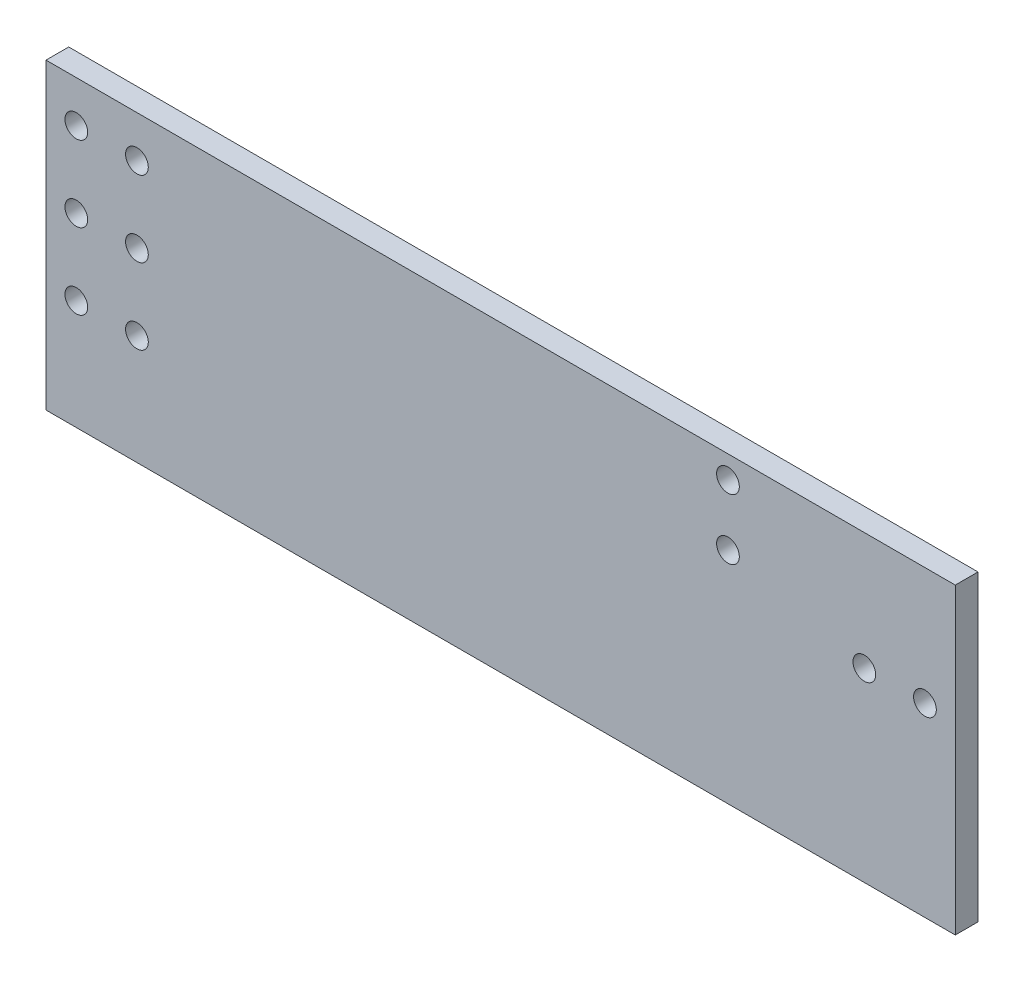
ISO-10303-21;
HEADER;
FILE_DESCRIPTION(('STEP AP214'),'2;1');
FILE_NAME('part.step','',(''),(''),'','','');
FILE_SCHEMA(('AUTOMOTIVE_DESIGN { 1 0 10303 214 1 1 1 1 }'));
ENDSEC;
DATA;
#1=APPLICATION_CONTEXT('core data for automotive mechanical design processes');
#2=APPLICATION_PROTOCOL_DEFINITION('international standard','automotive_design',2000,#1);
#3=PRODUCT_CONTEXT('',#1,'mechanical');
#4=PRODUCT('Part','Part','',(#3));
#5=PRODUCT_RELATED_PRODUCT_CATEGORY('part','',(#4));
#6=PRODUCT_DEFINITION_FORMATION('','',#4);
#7=PRODUCT_DEFINITION_CONTEXT('part definition',#1,'design');
#8=PRODUCT_DEFINITION('design','',#6,#7);
#9=PRODUCT_DEFINITION_SHAPE('','',#8);
#10=(LENGTH_UNIT() NAMED_UNIT(*) SI_UNIT(.MILLI.,.METRE.));
#11=(NAMED_UNIT(*) PLANE_ANGLE_UNIT() SI_UNIT($,.RADIAN.));
#12=(NAMED_UNIT(*) SI_UNIT($,.STERADIAN.) SOLID_ANGLE_UNIT());
#13=UNCERTAINTY_MEASURE_WITH_UNIT(LENGTH_MEASURE(1.E-05),#10,'distance_accuracy_value','');
#14=(GEOMETRIC_REPRESENTATION_CONTEXT(3) GLOBAL_UNCERTAINTY_ASSIGNED_CONTEXT((#13)) GLOBAL_UNIT_ASSIGNED_CONTEXT((#10,
#11,#12)) REPRESENTATION_CONTEXT('',''));
#15=CARTESIAN_POINT('',(0.,0.,0.));
#16=DIRECTION('',(0.,0.,1.));
#17=DIRECTION('',(1.,0.,0.));
#18=AXIS2_PLACEMENT_3D('',#15,#16,#17);
#19=CARTESIAN_POINT('',(0.,0.,3.));
#20=DIRECTION('',(0.,0.,-1.));
#21=DIRECTION('',(-1.,0.,0.));
#22=AXIS2_PLACEMENT_3D('',#19,#20,#21);
#23=PLANE('',#22);
#24=CARTESIAN_POINT('',(-56.0000000000058,0.,3.));
#25=DIRECTION('',(0.,0.,1.));
#26=DIRECTION('',(1.,0.,0.));
#27=AXIS2_PLACEMENT_3D('',#24,#25,#26);
#28=CIRCLE('',#27,1.5);
#29=CARTESIAN_POINT('',(-54.5000000000058,0.,3.));
#30=VERTEX_POINT('',#29);
#31=EDGE_CURVE('E140',#30,#30,#28,.T.);
#32=ORIENTED_EDGE('',*,*,#31,.F.);
#33=EDGE_LOOP('',(#32));
#34=FACE_BOUND('',#33,.T.);
#35=CARTESIAN_POINT('',(-56.,-9.99999999999998,3.));
#36=DIRECTION('',(0.,0.,1.));
#37=DIRECTION('',(-1.,0.,0.));
#38=AXIS2_PLACEMENT_3D('',#35,#36,#37);
#39=CIRCLE('',#38,1.5);
#40=CARTESIAN_POINT('',(-57.5,-9.99999999999998,3.));
#41=VERTEX_POINT('',#40);
#42=EDGE_CURVE('E128',#41,#41,#39,.T.);
#43=ORIENTED_EDGE('',*,*,#42,.F.);
#44=EDGE_LOOP('',(#43));
#45=FACE_BOUND('',#44,.T.);
#46=CARTESIAN_POINT('',(-56.,9.99999999999998,3.));
#47=DIRECTION('',(0.,0.,1.));
#48=DIRECTION('',(1.,0.,0.));
#49=AXIS2_PLACEMENT_3D('',#46,#47,#48);
#50=CIRCLE('',#49,1.5);
#51=CARTESIAN_POINT('',(-54.5,9.99999999999998,3.));
#52=VERTEX_POINT('',#51);
#53=EDGE_CURVE('E116',#52,#52,#50,.T.);
#54=ORIENTED_EDGE('',*,*,#53,.F.);
#55=EDGE_LOOP('',(#54));
#56=FACE_BOUND('',#55,.T.);
#57=CARTESIAN_POINT('',(56.,0.,3.));
#58=DIRECTION('',(0.,0.,1.));
#59=DIRECTION('',(1.,0.,0.));
#60=AXIS2_PLACEMENT_3D('',#57,#58,#59);
#61=CIRCLE('',#60,1.5);
#62=CARTESIAN_POINT('',(57.5,0.,3.));
#63=VERTEX_POINT('',#62);
#64=EDGE_CURVE('E104',#63,#63,#61,.T.);
#65=ORIENTED_EDGE('',*,*,#64,.F.);
#66=EDGE_LOOP('',(#65));
#67=FACE_BOUND('',#66,.T.);
#68=CARTESIAN_POINT('',(30.,4.49999999999997,3.));
#69=DIRECTION('',(0.,0.,1.));
#70=DIRECTION('',(1.,0.,0.));
#71=AXIS2_PLACEMENT_3D('',#68,#69,#70);
#72=CIRCLE('',#71,1.5);
#73=CARTESIAN_POINT('',(31.5,4.49999999999997,3.));
#74=VERTEX_POINT('',#73);
#75=EDGE_CURVE('E92',#74,#74,#72,.T.);
#76=ORIENTED_EDGE('',*,*,#75,.F.);
#77=EDGE_LOOP('',(#76));
#78=FACE_BOUND('',#77,.T.);
#79=DIRECTION('',(0.,-1.,0.));
#80=VECTOR('',#79,1.);
#81=CARTESIAN_POINT('',(-60.,-27.5,3.));
#82=LINE('',#81,#80);
#83=CARTESIAN_POINT('',(-60.,15.5,3.));
#84=VERTEX_POINT('',#83);
#85=CARTESIAN_POINT('',(-60.,-24.5,3.));
#86=VERTEX_POINT('',#85);
#87=EDGE_CURVE('E11',#84,#86,#82,.T.);
#88=ORIENTED_EDGE('',*,*,#87,.T.);
#89=DIRECTION('',(-1.,0.,0.));
#90=VECTOR('',#89,1.);
#91=CARTESIAN_POINT('',(-60.,-24.5,3.));
#92=LINE('',#91,#90);
#93=CARTESIAN_POINT('',(60.,-24.5,3.));
#94=VERTEX_POINT('',#93);
#95=EDGE_CURVE('E50',#94,#86,#92,.T.);
#96=ORIENTED_EDGE('',*,*,#95,.F.);
#97=DIRECTION('',(0.,1.,0.));
#98=VECTOR('',#97,1.);
#99=CARTESIAN_POINT('',(60.,-27.5,3.));
#100=LINE('',#99,#98);
#101=CARTESIAN_POINT('',(60.,15.5,3.));
#102=VERTEX_POINT('',#101);
#103=EDGE_CURVE('E42',#94,#102,#100,.T.);
#104=ORIENTED_EDGE('',*,*,#103,.T.);
#105=DIRECTION('',(1.,0.,0.));
#106=VECTOR('',#105,1.);
#107=CARTESIAN_POINT('',(-60.,15.5,3.));
#108=LINE('',#107,#106);
#109=EDGE_CURVE('E158',#84,#102,#108,.T.);
#110=ORIENTED_EDGE('',*,*,#109,.F.);
#111=EDGE_LOOP('',(#88,#96,#104,#110));
#112=FACE_BOUND('',#111,.T.);
#113=CARTESIAN_POINT('',(30.,12.5,3.));
#114=DIRECTION('',(0.,0.,1.));
#115=DIRECTION('',(1.,0.,0.));
#116=AXIS2_PLACEMENT_3D('',#113,#114,#115);
#117=CIRCLE('',#116,1.5);
#118=CARTESIAN_POINT('',(31.5,12.5,3.));
#119=VERTEX_POINT('',#118);
#120=EDGE_CURVE('E99',#119,#119,#117,.T.);
#121=ORIENTED_EDGE('',*,*,#120,.F.);
#122=EDGE_LOOP('',(#121));
#123=FACE_BOUND('',#122,.T.);
#124=CARTESIAN_POINT('',(48.,0.,3.));
#125=DIRECTION('',(0.,0.,1.));
#126=DIRECTION('',(1.,0.,0.));
#127=AXIS2_PLACEMENT_3D('',#124,#125,#126);
#128=CIRCLE('',#127,1.5);
#129=CARTESIAN_POINT('',(49.5,0.,3.));
#130=VERTEX_POINT('',#129);
#131=EDGE_CURVE('E110',#130,#130,#128,.T.);
#132=ORIENTED_EDGE('',*,*,#131,.F.);
#133=EDGE_LOOP('',(#132));
#134=FACE_BOUND('',#133,.T.);
#135=CARTESIAN_POINT('',(-48.,9.99999999999997,3.));
#136=DIRECTION('',(0.,0.,1.));
#137=DIRECTION('',(1.,0.,0.));
#138=AXIS2_PLACEMENT_3D('',#135,#136,#137);
#139=CIRCLE('',#138,1.5);
#140=CARTESIAN_POINT('',(-46.5,9.99999999999997,3.));
#141=VERTEX_POINT('',#140);
#142=EDGE_CURVE('E122',#141,#141,#139,.T.);
#143=ORIENTED_EDGE('',*,*,#142,.F.);
#144=EDGE_LOOP('',(#143));
#145=FACE_BOUND('',#144,.T.);
#146=CARTESIAN_POINT('',(-48.,-9.99999999999997,3.));
#147=DIRECTION('',(0.,0.,1.));
#148=DIRECTION('',(-1.,0.,0.));
#149=AXIS2_PLACEMENT_3D('',#146,#147,#148);
#150=CIRCLE('',#149,1.5);
#151=CARTESIAN_POINT('',(-49.5,-9.99999999999997,3.));
#152=VERTEX_POINT('',#151);
#153=EDGE_CURVE('E134',#152,#152,#150,.T.);
#154=ORIENTED_EDGE('',*,*,#153,.F.);
#155=EDGE_LOOP('',(#154));
#156=FACE_BOUND('',#155,.T.);
#157=CARTESIAN_POINT('',(-48.0000000000009,0.,3.));
#158=DIRECTION('',(0.,0.,1.));
#159=DIRECTION('',(1.,0.,0.));
#160=AXIS2_PLACEMENT_3D('',#157,#158,#159);
#161=CIRCLE('',#160,1.5);
#162=CARTESIAN_POINT('',(-46.5000000000009,0.,3.));
#163=VERTEX_POINT('',#162);
#164=EDGE_CURVE('E146',#163,#163,#161,.T.);
#165=ORIENTED_EDGE('',*,*,#164,.F.);
#166=EDGE_LOOP('',(#165));
#167=FACE_BOUND('',#166,.T.);
#168=ADVANCED_FACE('F33',(#34,#45,#56,#67,#78,#112,#123,#134,#145,#156,#167),#23,.F.);
#169=CARTESIAN_POINT('',(0.,0.,0.));
#170=DIRECTION('',(0.,0.,-1.));
#171=DIRECTION('',(-1.,0.,0.));
#172=AXIS2_PLACEMENT_3D('',#169,#170,#171);
#173=PLANE('',#172);
#174=DIRECTION('',(-1.,0.,0.));
#175=VECTOR('',#174,1.);
#176=CARTESIAN_POINT('',(-60.,-24.5,0.));
#177=LINE('',#176,#175);
#178=CARTESIAN_POINT('',(60.,-24.5,0.));
#179=VERTEX_POINT('',#178);
#180=CARTESIAN_POINT('',(-60.,-24.5,0.));
#181=VERTEX_POINT('',#180);
#182=EDGE_CURVE('E75',#179,#181,#177,.T.);
#183=ORIENTED_EDGE('',*,*,#182,.T.);
#184=DIRECTION('',(0.,-1.,0.));
#185=VECTOR('',#184,1.);
#186=CARTESIAN_POINT('',(-60.,-27.5,0.));
#187=LINE('',#186,#185);
#188=CARTESIAN_POINT('',(-60.,15.5,0.));
#189=VERTEX_POINT('',#188);
#190=EDGE_CURVE('E37',#189,#181,#187,.T.);
#191=ORIENTED_EDGE('',*,*,#190,.F.);
#192=DIRECTION('',(1.,0.,0.));
#193=VECTOR('',#192,1.);
#194=CARTESIAN_POINT('',(-60.,15.5,0.));
#195=LINE('',#194,#193);
#196=CARTESIAN_POINT('',(60.,15.5,0.));
#197=VERTEX_POINT('',#196);
#198=EDGE_CURVE('E58',#189,#197,#195,.T.);
#199=ORIENTED_EDGE('',*,*,#198,.T.);
#200=DIRECTION('',(0.,1.,0.));
#201=VECTOR('',#200,1.);
#202=CARTESIAN_POINT('',(60.,-27.5,0.));
#203=LINE('',#202,#201);
#204=EDGE_CURVE('E88',#179,#197,#203,.T.);
#205=ORIENTED_EDGE('',*,*,#204,.F.);
#206=EDGE_LOOP('',(#183,#191,#199,#205));
#207=FACE_BOUND('',#206,.T.);
#208=CARTESIAN_POINT('',(-56.0000000000058,0.,0.));
#209=DIRECTION('',(0.,0.,1.));
#210=DIRECTION('',(1.,0.,0.));
#211=AXIS2_PLACEMENT_3D('',#208,#209,#210);
#212=CIRCLE('',#211,1.5);
#213=CARTESIAN_POINT('',(-54.5000000000058,0.,0.));
#214=VERTEX_POINT('',#213);
#215=EDGE_CURVE('E143',#214,#214,#212,.T.);
#216=ORIENTED_EDGE('',*,*,#215,.T.);
#217=EDGE_LOOP('',(#216));
#218=FACE_BOUND('',#217,.T.);
#219=CARTESIAN_POINT('',(-56.,-9.99999999999998,0.));
#220=DIRECTION('',(0.,0.,1.));
#221=DIRECTION('',(-1.,0.,0.));
#222=AXIS2_PLACEMENT_3D('',#219,#220,#221);
#223=CIRCLE('',#222,1.5);
#224=CARTESIAN_POINT('',(-57.5,-9.99999999999998,0.));
#225=VERTEX_POINT('',#224);
#226=EDGE_CURVE('E131',#225,#225,#223,.T.);
#227=ORIENTED_EDGE('',*,*,#226,.T.);
#228=EDGE_LOOP('',(#227));
#229=FACE_BOUND('',#228,.T.);
#230=CARTESIAN_POINT('',(-56.,9.99999999999998,0.));
#231=DIRECTION('',(0.,0.,1.));
#232=DIRECTION('',(1.,0.,0.));
#233=AXIS2_PLACEMENT_3D('',#230,#231,#232);
#234=CIRCLE('',#233,1.5);
#235=CARTESIAN_POINT('',(-54.5,9.99999999999998,0.));
#236=VERTEX_POINT('',#235);
#237=EDGE_CURVE('E119',#236,#236,#234,.T.);
#238=ORIENTED_EDGE('',*,*,#237,.T.);
#239=EDGE_LOOP('',(#238));
#240=FACE_BOUND('',#239,.T.);
#241=CARTESIAN_POINT('',(56.,0.,0.));
#242=DIRECTION('',(0.,0.,1.));
#243=DIRECTION('',(1.,0.,0.));
#244=AXIS2_PLACEMENT_3D('',#241,#242,#243);
#245=CIRCLE('',#244,1.5);
#246=CARTESIAN_POINT('',(57.5,0.,0.));
#247=VERTEX_POINT('',#246);
#248=EDGE_CURVE('E107',#247,#247,#245,.T.);
#249=ORIENTED_EDGE('',*,*,#248,.T.);
#250=EDGE_LOOP('',(#249));
#251=FACE_BOUND('',#250,.T.);
#252=CARTESIAN_POINT('',(30.,4.49999999999997,0.));
#253=DIRECTION('',(0.,0.,1.));
#254=DIRECTION('',(1.,0.,0.));
#255=AXIS2_PLACEMENT_3D('',#252,#253,#254);
#256=CIRCLE('',#255,1.5);
#257=CARTESIAN_POINT('',(31.5,4.49999999999997,0.));
#258=VERTEX_POINT('',#257);
#259=EDGE_CURVE('E94',#258,#258,#256,.T.);
#260=ORIENTED_EDGE('',*,*,#259,.T.);
#261=EDGE_LOOP('',(#260));
#262=FACE_BOUND('',#261,.T.);
#263=CARTESIAN_POINT('',(30.,12.5,0.));
#264=DIRECTION('',(0.,0.,1.));
#265=DIRECTION('',(1.,0.,0.));
#266=AXIS2_PLACEMENT_3D('',#263,#264,#265);
#267=CIRCLE('',#266,1.5);
#268=CARTESIAN_POINT('',(31.5,12.5,0.));
#269=VERTEX_POINT('',#268);
#270=EDGE_CURVE('E101',#269,#269,#267,.T.);
#271=ORIENTED_EDGE('',*,*,#270,.T.);
#272=EDGE_LOOP('',(#271));
#273=FACE_BOUND('',#272,.T.);
#274=CARTESIAN_POINT('',(48.,0.,0.));
#275=DIRECTION('',(0.,0.,1.));
#276=DIRECTION('',(1.,0.,0.));
#277=AXIS2_PLACEMENT_3D('',#274,#275,#276);
#278=CIRCLE('',#277,1.5);
#279=CARTESIAN_POINT('',(49.5,0.,0.));
#280=VERTEX_POINT('',#279);
#281=EDGE_CURVE('E113',#280,#280,#278,.T.);
#282=ORIENTED_EDGE('',*,*,#281,.T.);
#283=EDGE_LOOP('',(#282));
#284=FACE_BOUND('',#283,.T.);
#285=CARTESIAN_POINT('',(-48.,9.99999999999997,0.));
#286=DIRECTION('',(0.,0.,1.));
#287=DIRECTION('',(1.,0.,0.));
#288=AXIS2_PLACEMENT_3D('',#285,#286,#287);
#289=CIRCLE('',#288,1.5);
#290=CARTESIAN_POINT('',(-46.5,9.99999999999997,0.));
#291=VERTEX_POINT('',#290);
#292=EDGE_CURVE('E125',#291,#291,#289,.T.);
#293=ORIENTED_EDGE('',*,*,#292,.T.);
#294=EDGE_LOOP('',(#293));
#295=FACE_BOUND('',#294,.T.);
#296=CARTESIAN_POINT('',(-48.,-9.99999999999997,0.));
#297=DIRECTION('',(0.,0.,1.));
#298=DIRECTION('',(-1.,0.,0.));
#299=AXIS2_PLACEMENT_3D('',#296,#297,#298);
#300=CIRCLE('',#299,1.5);
#301=CARTESIAN_POINT('',(-49.5,-9.99999999999997,0.));
#302=VERTEX_POINT('',#301);
#303=EDGE_CURVE('E137',#302,#302,#300,.T.);
#304=ORIENTED_EDGE('',*,*,#303,.T.);
#305=EDGE_LOOP('',(#304));
#306=FACE_BOUND('',#305,.T.);
#307=CARTESIAN_POINT('',(-48.0000000000009,0.,0.));
#308=DIRECTION('',(0.,0.,1.));
#309=DIRECTION('',(1.,0.,0.));
#310=AXIS2_PLACEMENT_3D('',#307,#308,#309);
#311=CIRCLE('',#310,1.5);
#312=CARTESIAN_POINT('',(-46.5000000000009,0.,0.));
#313=VERTEX_POINT('',#312);
#314=EDGE_CURVE('E149',#313,#313,#311,.T.);
#315=ORIENTED_EDGE('',*,*,#314,.T.);
#316=EDGE_LOOP('',(#315));
#317=FACE_BOUND('',#316,.T.);
#318=ADVANCED_FACE('F90',(#207,#218,#229,#240,#251,#262,#273,#284,#295,#306,#317),#173,.T.);
#319=CARTESIAN_POINT('',(60.,-27.5,3.));
#320=DIRECTION('',(-1.,0.,0.));
#321=DIRECTION('',(0.,0.,1.));
#322=AXIS2_PLACEMENT_3D('',#319,#320,#321);
#323=PLANE('',#322);
#324=ORIENTED_EDGE('',*,*,#103,.F.);
#325=DIRECTION('',(0.,0.,1.));
#326=VECTOR('',#325,1.);
#327=CARTESIAN_POINT('',(60.,-24.5,0.));
#328=LINE('',#327,#326);
#329=EDGE_CURVE('E78',#179,#94,#328,.T.);
#330=ORIENTED_EDGE('',*,*,#329,.F.);
#331=ORIENTED_EDGE('',*,*,#204,.T.);
#332=DIRECTION('',(0.,0.,1.));
#333=VECTOR('',#332,1.);
#334=CARTESIAN_POINT('',(60.,15.5,0.));
#335=LINE('',#334,#333);
#336=EDGE_CURVE('E152',#197,#102,#335,.T.);
#337=ORIENTED_EDGE('',*,*,#336,.T.);
#338=EDGE_LOOP('',(#324,#330,#331,#337));
#339=FACE_BOUND('',#338,.T.);
#340=ADVANCED_FACE('F35',(#339),#323,.F.);
#341=CARTESIAN_POINT('',(-60.,-27.5,3.));
#342=DIRECTION('',(1.,0.,0.));
#343=DIRECTION('',(0.,0.,-1.));
#344=AXIS2_PLACEMENT_3D('',#341,#342,#343);
#345=PLANE('',#344);
#346=ORIENTED_EDGE('',*,*,#190,.T.);
#347=DIRECTION('',(0.,0.,1.));
#348=VECTOR('',#347,1.);
#349=CARTESIAN_POINT('',(-60.,-24.5,0.));
#350=LINE('',#349,#348);
#351=EDGE_CURVE('E79',#181,#86,#350,.T.);
#352=ORIENTED_EDGE('',*,*,#351,.T.);
#353=ORIENTED_EDGE('',*,*,#87,.F.);
#354=DIRECTION('',(0.,0.,1.));
#355=VECTOR('',#354,1.);
#356=CARTESIAN_POINT('',(-60.,15.5,0.));
#357=LINE('',#356,#355);
#358=EDGE_CURVE('E155',#189,#84,#357,.T.);
#359=ORIENTED_EDGE('',*,*,#358,.F.);
#360=EDGE_LOOP('',(#346,#352,#353,#359));
#361=FACE_BOUND('',#360,.T.);
#362=ADVANCED_FACE('F165',(#361),#345,.F.);
#363=CARTESIAN_POINT('',(30.,4.49999999999997,3.));
#364=DIRECTION('',(0.,0.,-1.));
#365=DIRECTION('',(-1.,0.,0.));
#366=AXIS2_PLACEMENT_3D('',#363,#364,#365);
#367=CYLINDRICAL_SURFACE('',#366,1.5);
#368=ORIENTED_EDGE('',*,*,#75,.T.);
#369=EDGE_LOOP('',(#368));
#370=FACE_BOUND('',#369,.T.);
#371=ORIENTED_EDGE('',*,*,#259,.F.);
#372=EDGE_LOOP('',(#371));
#373=FACE_BOUND('',#372,.T.);
#374=ADVANCED_FACE('F191',(#370,#373),#367,.F.);
#375=CARTESIAN_POINT('',(30.,12.5,3.));
#376=DIRECTION('',(0.,0.,-1.));
#377=DIRECTION('',(-1.,0.,0.));
#378=AXIS2_PLACEMENT_3D('',#375,#376,#377);
#379=CYLINDRICAL_SURFACE('',#378,1.5);
#380=ORIENTED_EDGE('',*,*,#120,.T.);
#381=EDGE_LOOP('',(#380));
#382=FACE_BOUND('',#381,.T.);
#383=ORIENTED_EDGE('',*,*,#270,.F.);
#384=EDGE_LOOP('',(#383));
#385=FACE_BOUND('',#384,.T.);
#386=ADVANCED_FACE('F199',(#382,#385),#379,.F.);
#387=CARTESIAN_POINT('',(56.,0.,3.));
#388=DIRECTION('',(0.,0.,-1.));
#389=DIRECTION('',(-1.,0.,0.));
#390=AXIS2_PLACEMENT_3D('',#387,#388,#389);
#391=CYLINDRICAL_SURFACE('',#390,1.5);
#392=ORIENTED_EDGE('',*,*,#64,.T.);
#393=EDGE_LOOP('',(#392));
#394=FACE_BOUND('',#393,.T.);
#395=ORIENTED_EDGE('',*,*,#248,.F.);
#396=EDGE_LOOP('',(#395));
#397=FACE_BOUND('',#396,.T.);
#398=ADVANCED_FACE('F232',(#394,#397),#391,.F.);
#399=CARTESIAN_POINT('',(48.,0.,3.));
#400=DIRECTION('',(0.,0.,-1.));
#401=DIRECTION('',(-1.,0.,0.));
#402=AXIS2_PLACEMENT_3D('',#399,#400,#401);
#403=CYLINDRICAL_SURFACE('',#402,1.5);
#404=ORIENTED_EDGE('',*,*,#131,.T.);
#405=EDGE_LOOP('',(#404));
#406=FACE_BOUND('',#405,.T.);
#407=ORIENTED_EDGE('',*,*,#281,.F.);
#408=EDGE_LOOP('',(#407));
#409=FACE_BOUND('',#408,.T.);
#410=ADVANCED_FACE('F240',(#406,#409),#403,.F.);
#411=CARTESIAN_POINT('',(-56.,9.99999999999998,3.));
#412=DIRECTION('',(0.,0.,-1.));
#413=DIRECTION('',(-1.,0.,0.));
#414=AXIS2_PLACEMENT_3D('',#411,#412,#413);
#415=CYLINDRICAL_SURFACE('',#414,1.5);
#416=ORIENTED_EDGE('',*,*,#53,.T.);
#417=EDGE_LOOP('',(#416));
#418=FACE_BOUND('',#417,.T.);
#419=ORIENTED_EDGE('',*,*,#237,.F.);
#420=EDGE_LOOP('',(#419));
#421=FACE_BOUND('',#420,.T.);
#422=ADVANCED_FACE('F249',(#418,#421),#415,.F.);
#423=CARTESIAN_POINT('',(-48.,9.99999999999997,3.));
#424=DIRECTION('',(0.,0.,-1.));
#425=DIRECTION('',(-1.,0.,0.));
#426=AXIS2_PLACEMENT_3D('',#423,#424,#425);
#427=CYLINDRICAL_SURFACE('',#426,1.5);
#428=ORIENTED_EDGE('',*,*,#142,.T.);
#429=EDGE_LOOP('',(#428));
#430=FACE_BOUND('',#429,.T.);
#431=ORIENTED_EDGE('',*,*,#292,.F.);
#432=EDGE_LOOP('',(#431));
#433=FACE_BOUND('',#432,.T.);
#434=ADVANCED_FACE('F258',(#430,#433),#427,.F.);
#435=CARTESIAN_POINT('',(-56.,-9.99999999999998,3.));
#436=DIRECTION('',(0.,0.,-1.));
#437=DIRECTION('',(-1.,0.,0.));
#438=AXIS2_PLACEMENT_3D('',#435,#436,#437);
#439=CYLINDRICAL_SURFACE('',#438,1.5);
#440=ORIENTED_EDGE('',*,*,#42,.T.);
#441=EDGE_LOOP('',(#440));
#442=FACE_BOUND('',#441,.T.);
#443=ORIENTED_EDGE('',*,*,#226,.F.);
#444=EDGE_LOOP('',(#443));
#445=FACE_BOUND('',#444,.T.);
#446=ADVANCED_FACE('F267',(#442,#445),#439,.F.);
#447=CARTESIAN_POINT('',(-48.,-9.99999999999997,3.));
#448=DIRECTION('',(0.,0.,-1.));
#449=DIRECTION('',(-1.,0.,0.));
#450=AXIS2_PLACEMENT_3D('',#447,#448,#449);
#451=CYLINDRICAL_SURFACE('',#450,1.5);
#452=ORIENTED_EDGE('',*,*,#153,.T.);
#453=EDGE_LOOP('',(#452));
#454=FACE_BOUND('',#453,.T.);
#455=ORIENTED_EDGE('',*,*,#303,.F.);
#456=EDGE_LOOP('',(#455));
#457=FACE_BOUND('',#456,.T.);
#458=ADVANCED_FACE('F276',(#454,#457),#451,.F.);
#459=CARTESIAN_POINT('',(-56.0000000000058,0.,3.));
#460=DIRECTION('',(0.,0.,-1.));
#461=DIRECTION('',(-1.,0.,0.));
#462=AXIS2_PLACEMENT_3D('',#459,#460,#461);
#463=CYLINDRICAL_SURFACE('',#462,1.5);
#464=ORIENTED_EDGE('',*,*,#31,.T.);
#465=EDGE_LOOP('',(#464));
#466=FACE_BOUND('',#465,.T.);
#467=ORIENTED_EDGE('',*,*,#215,.F.);
#468=EDGE_LOOP('',(#467));
#469=FACE_BOUND('',#468,.T.);
#470=ADVANCED_FACE('F178',(#466,#469),#463,.F.);
#471=CARTESIAN_POINT('',(-48.0000000000009,0.,3.));
#472=DIRECTION('',(0.,0.,-1.));
#473=DIRECTION('',(-1.,0.,0.));
#474=AXIS2_PLACEMENT_3D('',#471,#472,#473);
#475=CYLINDRICAL_SURFACE('',#474,1.5);
#476=ORIENTED_EDGE('',*,*,#164,.T.);
#477=EDGE_LOOP('',(#476));
#478=FACE_BOUND('',#477,.T.);
#479=ORIENTED_EDGE('',*,*,#314,.F.);
#480=EDGE_LOOP('',(#479));
#481=FACE_BOUND('',#480,.T.);
#482=ADVANCED_FACE('F171',(#478,#481),#475,.F.);
#483=CARTESIAN_POINT('',(-60.,15.5,0.));
#484=DIRECTION('',(0.,-1.,0.));
#485=DIRECTION('',(1.,0.,0.));
#486=AXIS2_PLACEMENT_3D('',#483,#484,#485);
#487=PLANE('',#486);
#488=ORIENTED_EDGE('',*,*,#109,.T.);
#489=ORIENTED_EDGE('',*,*,#336,.F.);
#490=ORIENTED_EDGE('',*,*,#198,.F.);
#491=ORIENTED_EDGE('',*,*,#358,.T.);
#492=EDGE_LOOP('',(#488,#489,#490,#491));
#493=FACE_BOUND('',#492,.T.);
#494=ADVANCED_FACE('F169',(#493),#487,.F.);
#495=CARTESIAN_POINT('',(-60.,-24.5,0.));
#496=DIRECTION('',(0.,1.,0.));
#497=DIRECTION('',(0.,0.,1.));
#498=AXIS2_PLACEMENT_3D('',#495,#496,#497);
#499=PLANE('',#498);
#500=ORIENTED_EDGE('',*,*,#95,.T.);
#501=ORIENTED_EDGE('',*,*,#351,.F.);
#502=ORIENTED_EDGE('',*,*,#182,.F.);
#503=ORIENTED_EDGE('',*,*,#329,.T.);
#504=EDGE_LOOP('',(#500,#501,#502,#503));
#505=FACE_BOUND('',#504,.T.);
#506=ADVANCED_FACE('F77',(#505),#499,.F.);
#507=CLOSED_SHELL('',(#168,#318,#340,#362,#374,#386,#398,#410,#422,#434,#446,#458,#470,#482,
#494,#506));
#508=MANIFOLD_SOLID_BREP('B2',#507);
#509=ADVANCED_BREP_SHAPE_REPRESENTATION('',(#18,#508),#14);
#510=SHAPE_DEFINITION_REPRESENTATION(#9,#509);
ENDSEC;
END-ISO-10303-21;
